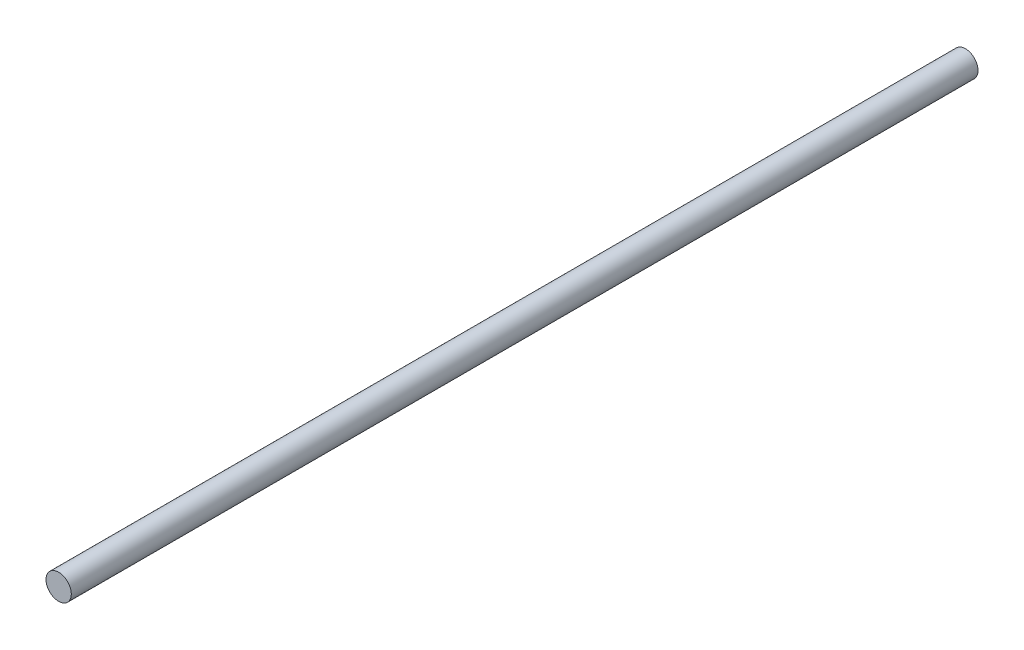
ISO-10303-21;
HEADER;
FILE_DESCRIPTION(('STEP AP214'),'2;1');
FILE_NAME('part.step','',(''),(''),'','','');
FILE_SCHEMA(('AUTOMOTIVE_DESIGN { 1 0 10303 214 1 1 1 1 }'));
ENDSEC;
DATA;
#1=APPLICATION_CONTEXT('core data for automotive mechanical design processes');
#2=APPLICATION_PROTOCOL_DEFINITION('international standard','automotive_design',2000,#1);
#3=PRODUCT_CONTEXT('',#1,'mechanical');
#4=PRODUCT('Part','Part','',(#3));
#5=PRODUCT_RELATED_PRODUCT_CATEGORY('part','',(#4));
#6=PRODUCT_DEFINITION_FORMATION('','',#4);
#7=PRODUCT_DEFINITION_CONTEXT('part definition',#1,'design');
#8=PRODUCT_DEFINITION('design','',#6,#7);
#9=PRODUCT_DEFINITION_SHAPE('','',#8);
#10=(LENGTH_UNIT() NAMED_UNIT(*) SI_UNIT(.MILLI.,.METRE.));
#11=(NAMED_UNIT(*) PLANE_ANGLE_UNIT() SI_UNIT($,.RADIAN.));
#12=(NAMED_UNIT(*) SI_UNIT($,.STERADIAN.) SOLID_ANGLE_UNIT());
#13=UNCERTAINTY_MEASURE_WITH_UNIT(LENGTH_MEASURE(1.E-05),#10,'distance_accuracy_value','');
#14=(GEOMETRIC_REPRESENTATION_CONTEXT(3) GLOBAL_UNCERTAINTY_ASSIGNED_CONTEXT((#13)) GLOBAL_UNIT_ASSIGNED_CONTEXT((#10,
#11,#12)) REPRESENTATION_CONTEXT('',''));
#15=CARTESIAN_POINT('',(0.,0.,0.));
#16=DIRECTION('',(0.,0.,1.));
#17=DIRECTION('',(1.,0.,0.));
#18=AXIS2_PLACEMENT_3D('',#15,#16,#17);
#19=CARTESIAN_POINT('',(0.,0.,107.6));
#20=DIRECTION('',(0.,0.,-1.));
#21=DIRECTION('',(-1.,0.,0.));
#22=AXIS2_PLACEMENT_3D('',#19,#20,#21);
#23=CYLINDRICAL_SURFACE('',#22,1.5);
#24=CARTESIAN_POINT('',(0.,0.,107.6));
#25=DIRECTION('',(0.,0.,1.));
#26=DIRECTION('',(1.,0.,0.));
#27=AXIS2_PLACEMENT_3D('',#24,#25,#26);
#28=CIRCLE('',#27,1.5);
#29=CARTESIAN_POINT('',(-1.5,0.,107.6));
#30=VERTEX_POINT('',#29);
#31=EDGE_CURVE('E10',#30,#30,#28,.T.);
#32=CARTESIAN_POINT('',(0.,0.,0.));
#33=DIRECTION('',(0.,0.,1.));
#34=DIRECTION('',(1.,0.,0.));
#35=AXIS2_PLACEMENT_3D('',#32,#33,#34);
#36=CIRCLE('',#35,1.5);
#37=CARTESIAN_POINT('',(-1.5,0.,0.));
#38=VERTEX_POINT('',#37);
#39=EDGE_CURVE('E40',#38,#38,#36,.T.);
#40=CARTESIAN_POINT('',(-1.5,0.,107.6));
#41=CARTESIAN_POINT('',(-1.5,0.,106.479166666667));
#42=CARTESIAN_POINT('',(-1.5,0.,105.358333333333));
#43=CARTESIAN_POINT('',(-1.5,0.,103.116666666667));
#44=CARTESIAN_POINT('',(-1.5,0.,101.995833333333));
#45=CARTESIAN_POINT('',(-1.5,0.,99.7541666666667));
#46=CARTESIAN_POINT('',(-1.5,0.,98.6333333333333));
#47=CARTESIAN_POINT('',(-1.5,0.,96.3916666666667));
#48=CARTESIAN_POINT('',(-1.5,0.,95.2708333333333));
#49=CARTESIAN_POINT('',(-1.5,0.,93.0291666666667));
#50=CARTESIAN_POINT('',(-1.5,0.,91.9083333333333));
#51=CARTESIAN_POINT('',(-1.5,0.,89.6666666666667));
#52=CARTESIAN_POINT('',(-1.5,0.,88.5458333333333));
#53=CARTESIAN_POINT('',(-1.5,0.,86.3041666666667));
#54=CARTESIAN_POINT('',(-1.5,0.,85.1833333333333));
#55=CARTESIAN_POINT('',(-1.5,0.,82.9416666666666));
#56=CARTESIAN_POINT('',(-1.5,0.,81.8208333333333));
#57=CARTESIAN_POINT('',(-1.5,0.,79.5791666666667));
#58=CARTESIAN_POINT('',(-1.5,0.,78.4583333333333));
#59=CARTESIAN_POINT('',(-1.5,0.,76.2166666666667));
#60=CARTESIAN_POINT('',(-1.5,0.,75.0958333333333));
#61=CARTESIAN_POINT('',(-1.5,0.,72.8541666666667));
#62=CARTESIAN_POINT('',(-1.5,0.,71.7333333333333));
#63=CARTESIAN_POINT('',(-1.5,0.,69.4916666666667));
#64=CARTESIAN_POINT('',(-1.5,0.,68.3708333333333));
#65=CARTESIAN_POINT('',(-1.5,0.,66.1291666666666));
#66=CARTESIAN_POINT('',(-1.5,0.,65.0083333333333));
#67=CARTESIAN_POINT('',(-1.5,0.,62.7666666666667));
#68=CARTESIAN_POINT('',(-1.5,0.,61.6458333333333));
#69=CARTESIAN_POINT('',(-1.5,0.,59.4041666666667));
#70=CARTESIAN_POINT('',(-1.5,0.,58.2833333333333));
#71=CARTESIAN_POINT('',(-1.5,0.,56.0416666666667));
#72=CARTESIAN_POINT('',(-1.5,0.,54.9208333333333));
#73=CARTESIAN_POINT('',(-1.5,0.,52.6791666666667));
#74=CARTESIAN_POINT('',(-1.5,0.,51.5583333333333));
#75=CARTESIAN_POINT('',(-1.5,0.,49.3166666666666));
#76=CARTESIAN_POINT('',(-1.5,0.,48.1958333333333));
#77=CARTESIAN_POINT('',(-1.5,0.,45.9541666666667));
#78=CARTESIAN_POINT('',(-1.5,0.,44.8333333333333));
#79=CARTESIAN_POINT('',(-1.5,0.,42.5916666666667));
#80=CARTESIAN_POINT('',(-1.5,0.,41.4708333333333));
#81=CARTESIAN_POINT('',(-1.5,0.,39.2291666666667));
#82=CARTESIAN_POINT('',(-1.5,0.,38.1083333333333));
#83=CARTESIAN_POINT('',(-1.5,0.,35.8666666666667));
#84=CARTESIAN_POINT('',(-1.5,0.,34.7458333333333));
#85=CARTESIAN_POINT('',(-1.5,0.,32.5041666666667));
#86=CARTESIAN_POINT('',(-1.5,0.,31.3833333333333));
#87=CARTESIAN_POINT('',(-1.5,0.,29.1416666666667));
#88=CARTESIAN_POINT('',(-1.5,0.,28.0208333333333));
#89=CARTESIAN_POINT('',(-1.5,0.,25.7791666666667));
#90=CARTESIAN_POINT('',(-1.5,0.,24.6583333333333));
#91=CARTESIAN_POINT('',(-1.5,0.,22.4166666666667));
#92=CARTESIAN_POINT('',(-1.5,0.,21.2958333333333));
#93=CARTESIAN_POINT('',(-1.5,0.,19.0541666666667));
#94=CARTESIAN_POINT('',(-1.5,0.,17.9333333333333));
#95=CARTESIAN_POINT('',(-1.5,0.,15.6916666666667));
#96=CARTESIAN_POINT('',(-1.5,0.,14.5708333333333));
#97=CARTESIAN_POINT('',(-1.5,0.,12.3291666666667));
#98=CARTESIAN_POINT('',(-1.5,0.,11.2083333333333));
#99=CARTESIAN_POINT('',(-1.5,0.,8.96666666666666));
#100=CARTESIAN_POINT('',(-1.5,0.,7.84583333333332));
#101=CARTESIAN_POINT('',(-1.5,0.,5.60416666666666));
#102=CARTESIAN_POINT('',(-1.5,0.,4.48333333333333));
#103=CARTESIAN_POINT('',(-1.5,0.,2.24166666666666));
#104=CARTESIAN_POINT('',(-1.5,0.,1.12083333333332));
#105=CARTESIAN_POINT('',(-1.5,0.,0.));
#106=B_SPLINE_CURVE_WITH_KNOTS('',3,(#40,#41,#42,#43,#44,#45,#46,#47,#48,#49,#50,#51,#52,#53,
#54,#55,#56,#57,#58,#59,#60,#61,#62,#63,#64,#65,#66,#67,#68,#69,#70,#71,#72,#73,#74,#75,#76,#77,
#78,#79,#80,#81,#82,#83,#84,#85,#86,#87,#88,#89,#90,#91,#92,#93,#94,#95,#96,#97,#98,#99,#100,
#101,#102,#103,#104,#105),.UNSPECIFIED.,.F.,.F.,(4,2,2,2,2,2,2,2,2,2,2,2,2,2,2,2,2,2,2,2,2,2,2,
2,2,2,2,2,2,2,2,2,4),(0.,3.3625,6.72500000000001,10.0875,13.45,16.8125,20.175,23.5375,26.9,
30.2625,33.625,36.9875,40.35,43.7125,47.075,50.4375,53.8,57.1625,60.525,63.8875,67.25,70.6125,
73.975,77.3375,80.7,84.0625,87.425,90.7875,94.15,97.5125,100.875,104.2375,107.6),.UNSPECIFIED.);
#107=EDGE_CURVE('BSEAM37',#30,#38,#106,.T.);
#108=ORIENTED_EDGE('',*,*,#31,.F.);
#109=ORIENTED_EDGE('',*,*,#39,.T.);
#110=ORIENTED_EDGE('',*,*,#107,.T.);
#111=ORIENTED_EDGE('',*,*,#107,.F.);
#112=EDGE_LOOP('',(#108,#110,#109,#111));
#113=FACE_BOUND('',#112,.T.);
#114=ADVANCED_FACE('F37',(#113),#23,.T.);
#115=CARTESIAN_POINT('',(0.,0.,107.6));
#116=DIRECTION('',(0.,0.,1.));
#117=DIRECTION('',(1.,0.,0.));
#118=AXIS2_PLACEMENT_3D('',#115,#116,#117);
#119=PLANE('',#118);
#120=ORIENTED_EDGE('',*,*,#31,.T.);
#121=EDGE_LOOP('',(#120));
#122=FACE_BOUND('',#121,.T.);
#123=ADVANCED_FACE('F52',(#122),#119,.T.);
#124=CARTESIAN_POINT('',(0.,0.,0.));
#125=DIRECTION('',(0.,0.,1.));
#126=DIRECTION('',(1.,0.,0.));
#127=AXIS2_PLACEMENT_3D('',#124,#125,#126);
#128=PLANE('',#127);
#129=ORIENTED_EDGE('',*,*,#39,.F.);
#130=EDGE_LOOP('',(#129));
#131=FACE_BOUND('',#130,.T.);
#132=ADVANCED_FACE('F50',(#131),#128,.F.);
#133=CLOSED_SHELL('',(#114,#123,#132));
#134=MANIFOLD_SOLID_BREP('B2',#133);
#135=ADVANCED_BREP_SHAPE_REPRESENTATION('',(#18,#134),#14);
#136=SHAPE_DEFINITION_REPRESENTATION(#9,#135);
ENDSEC;
END-ISO-10303-21;
